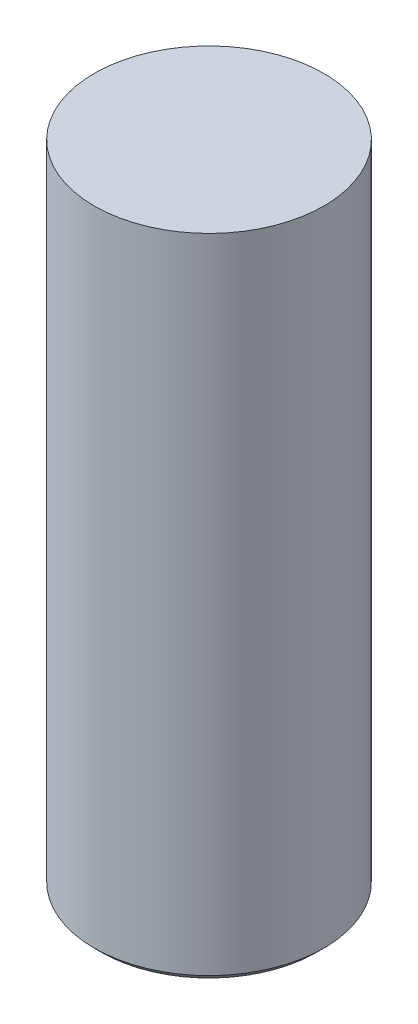
ISO-10303-21;
HEADER;
FILE_DESCRIPTION(('STEP AP214'),'2;1');
FILE_NAME('part.step','',(''),(''),'','','');
FILE_SCHEMA(('AUTOMOTIVE_DESIGN { 1 0 10303 214 1 1 1 1 }'));
ENDSEC;
DATA;
#1=APPLICATION_CONTEXT('core data for automotive mechanical design processes');
#2=APPLICATION_PROTOCOL_DEFINITION('international standard','automotive_design',2000,#1);
#3=PRODUCT_CONTEXT('',#1,'mechanical');
#4=PRODUCT('Part','Part','',(#3));
#5=PRODUCT_RELATED_PRODUCT_CATEGORY('part','',(#4));
#6=PRODUCT_DEFINITION_FORMATION('','',#4);
#7=PRODUCT_DEFINITION_CONTEXT('part definition',#1,'design');
#8=PRODUCT_DEFINITION('design','',#6,#7);
#9=PRODUCT_DEFINITION_SHAPE('','',#8);
#10=(LENGTH_UNIT() NAMED_UNIT(*) SI_UNIT(.MILLI.,.METRE.));
#11=(NAMED_UNIT(*) PLANE_ANGLE_UNIT() SI_UNIT($,.RADIAN.));
#12=(NAMED_UNIT(*) SI_UNIT($,.STERADIAN.) SOLID_ANGLE_UNIT());
#13=UNCERTAINTY_MEASURE_WITH_UNIT(LENGTH_MEASURE(1.E-05),#10,'distance_accuracy_value','');
#14=(GEOMETRIC_REPRESENTATION_CONTEXT(3) GLOBAL_UNCERTAINTY_ASSIGNED_CONTEXT((#13)) GLOBAL_UNIT_ASSIGNED_CONTEXT((#10,
#11,#12)) REPRESENTATION_CONTEXT('',''));
#15=CARTESIAN_POINT('',(0.,0.,0.));
#16=DIRECTION('',(0.,0.,1.));
#17=DIRECTION('',(1.,0.,0.));
#18=AXIS2_PLACEMENT_3D('',#15,#16,#17);
#19=CARTESIAN_POINT('',(-8.59293519854445E-07,-21.7000021129847,0.089999161225423));
#20=DIRECTION('',(0.,-1.,0.));
#21=DIRECTION('',(1.,0.,0.));
#22=AXIS2_PLACEMENT_3D('',#19,#20,#21);
#23=PLANE('',#22);
#24=CARTESIAN_POINT('',(-8.59293519585996E-07,-21.7000021129281,-8.38774575359183E-07));
#25=DIRECTION('',(0.,1.,0.));
#26=DIRECTION('',(0.,0.,1.));
#27=AXIS2_PLACEMENT_3D('',#24,#25,#26);
#28=CIRCLE('',#27,3.72500000003129);
#29=CARTESIAN_POINT('',(-8.59293519585996E-07,-21.7000021129281,3.72499916125671));
#30=VERTEX_POINT('',#29);
#31=EDGE_CURVE('E18',#30,#30,#28,.T.);
#32=ORIENTED_EDGE('',*,*,#31,.F.);
#33=EDGE_LOOP('',(#32));
#34=FACE_BOUND('',#33,.T.);
#35=ADVANCED_FACE('F15',(#34),#23,.T.);
#36=CARTESIAN_POINT('',(-2.34375,0.8,0.));
#37=DIRECTION('',(0.,-1.,0.));
#38=DIRECTION('',(1.,0.,0.));
#39=AXIS2_PLACEMENT_3D('',#36,#37,#38);
#40=PLANE('',#39);
#41=CARTESIAN_POINT('',(-8.59293519677719E-07,0.799999944206986,-8.38774575592787E-07));
#42=DIRECTION('',(0.,1.,0.));
#43=DIRECTION('',(0.,0.,1.));
#44=AXIS2_PLACEMENT_3D('',#41,#42,#43);
#45=CIRCLE('',#44,3.975);
#46=CARTESIAN_POINT('',(-8.59293519677719E-07,0.799999944206986,3.97499916122542));
#47=VERTEX_POINT('',#46);
#48=EDGE_CURVE('E23',#47,#47,#45,.F.);
#49=ORIENTED_EDGE('',*,*,#48,.F.);
#50=EDGE_LOOP('',(#49));
#51=FACE_BOUND('',#50,.T.);
#52=ADVANCED_FACE('F38',(#51),#40,.F.);
#53=CARTESIAN_POINT('',(-8.59293519585996E-07,-21.4500021130561,-8.38774575359183E-07));
#54=DIRECTION('',(0.,1.,0.));
#55=DIRECTION('',(0.,0.,1.));
#56=AXIS2_PLACEMENT_3D('',#53,#54,#55);
#57=CONICAL_SURFACE('',#56,3.97499999996009,0.785398163511136);
#58=CARTESIAN_POINT('',(-8.59293519672895E-07,-21.4500021129846,-8.38774575359183E-07));
#59=DIRECTION('',(0.,1.,0.));
#60=DIRECTION('',(0.,0.,1.));
#61=AXIS2_PLACEMENT_3D('',#58,#59,#60);
#62=CIRCLE('',#61,3.975);
#63=CARTESIAN_POINT('',(-8.59293519672895E-07,-21.4500021129846,3.97499916122543));
#64=VERTEX_POINT('',#63);
#65=EDGE_CURVE('E10',#64,#64,#62,.T.);
#66=ORIENTED_EDGE('',*,*,#65,.F.);
#67=EDGE_LOOP('',(#66));
#68=FACE_BOUND('',#67,.T.);
#69=ORIENTED_EDGE('',*,*,#31,.T.);
#70=EDGE_LOOP('',(#69));
#71=FACE_BOUND('',#70,.T.);
#72=ADVANCED_FACE('F35',(#68,#71),#57,.T.);
#73=CARTESIAN_POINT('',(-8.59293519672732E-07,-22.2000021129846,-8.38774575351309E-07));
#74=DIRECTION('',(0.,1.,0.));
#75=DIRECTION('',(0.,0.,1.));
#76=AXIS2_PLACEMENT_3D('',#73,#74,#75);
#77=CYLINDRICAL_SURFACE('',#76,3.975);
#78=ORIENTED_EDGE('',*,*,#65,.T.);
#79=EDGE_LOOP('',(#78));
#80=FACE_BOUND('',#79,.T.);
#81=ORIENTED_EDGE('',*,*,#48,.T.);
#82=EDGE_LOOP('',(#81));
#83=FACE_BOUND('',#82,.T.);
#84=ADVANCED_FACE('F44',(#80,#83),#77,.T.);
#85=CLOSED_SHELL('',(#35,#52,#72,#84));
#86=MANIFOLD_SOLID_BREP('B1',#85);
#87=ADVANCED_BREP_SHAPE_REPRESENTATION('',(#18,#86),#14);
#88=SHAPE_DEFINITION_REPRESENTATION(#9,#87);
ENDSEC;
END-ISO-10303-21;
